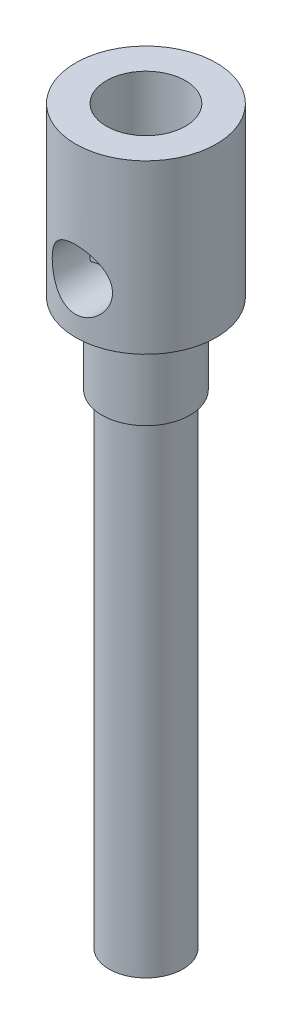
ISO-10303-21;
HEADER;
FILE_DESCRIPTION(('STEP AP214'),'2;1');
FILE_NAME('part.step','',(''),(''),'','','');
FILE_SCHEMA(('AUTOMOTIVE_DESIGN { 1 0 10303 214 1 1 1 1 }'));
ENDSEC;
DATA;
#1=APPLICATION_CONTEXT('core data for automotive mechanical design processes');
#2=APPLICATION_PROTOCOL_DEFINITION('international standard','automotive_design',2000,#1);
#3=PRODUCT_CONTEXT('',#1,'mechanical');
#4=PRODUCT('Part','Part','',(#3));
#5=PRODUCT_RELATED_PRODUCT_CATEGORY('part','',(#4));
#6=PRODUCT_DEFINITION_FORMATION('','',#4);
#7=PRODUCT_DEFINITION_CONTEXT('part definition',#1,'design');
#8=PRODUCT_DEFINITION('design','',#6,#7);
#9=PRODUCT_DEFINITION_SHAPE('','',#8);
#10=(LENGTH_UNIT() NAMED_UNIT(*) SI_UNIT(.MILLI.,.METRE.));
#11=(NAMED_UNIT(*) PLANE_ANGLE_UNIT() SI_UNIT($,.RADIAN.));
#12=(NAMED_UNIT(*) SI_UNIT($,.STERADIAN.) SOLID_ANGLE_UNIT());
#13=UNCERTAINTY_MEASURE_WITH_UNIT(LENGTH_MEASURE(1.E-05),#10,'distance_accuracy_value','');
#14=(GEOMETRIC_REPRESENTATION_CONTEXT(3) GLOBAL_UNCERTAINTY_ASSIGNED_CONTEXT((#13)) GLOBAL_UNIT_ASSIGNED_CONTEXT((#10,
#11,#12)) REPRESENTATION_CONTEXT('',''));
#15=CARTESIAN_POINT('',(0.,0.,0.));
#16=DIRECTION('',(0.,0.,1.));
#17=DIRECTION('',(1.,0.,0.));
#18=AXIS2_PLACEMENT_3D('',#15,#16,#17);
#19=CARTESIAN_POINT('',(0.,89.14,0.));
#20=DIRECTION('',(0.,1.,0.));
#21=DIRECTION('',(0.,0.,1.));
#22=AXIS2_PLACEMENT_3D('',#19,#20,#21);
#23=CONICAL_SURFACE('',#22,5.9,1.02974425867665);
#24=CARTESIAN_POINT('',(3.83789669676033,89.2904151547569,4.80594872874396));
#25=CARTESIAN_POINT('',(3.81465501508832,89.2524553964176,4.7436619122395));
#26=CARTESIAN_POINT('',(3.79059768278098,89.2144193572263,4.68172796314178));
#27=CARTESIAN_POINT('',(3.74070963196909,89.1381664999014,4.55867018536252));
#28=CARTESIAN_POINT('',(3.71487850955702,89.099949642451,4.49754654500099));
#29=CARTESIAN_POINT('',(3.63426595913431,88.9846371897143,4.31499756764214));
#30=CARTESIAN_POINT('',(3.57658974693528,88.9072503362683,4.19500531967459));
#31=CARTESIAN_POINT('',(3.45009227103632,88.7490719252159,3.95649410737801));
#32=CARTESIAN_POINT('',(3.3809666557596,88.6682521421191,3.83815363347766));
#33=CARTESIAN_POINT('',(3.23102157751017,88.5058808773594,3.6099209461963));
#34=CARTESIAN_POINT('',(3.15022788553552,88.4243313703607,3.50001091114363));
#35=CARTESIAN_POINT('',(3.01823690977529,88.3017623473378,3.34435645403201));
#36=CARTESIAN_POINT('',(2.9724116391185,88.260842619087,3.29398154404596));
#37=CARTESIAN_POINT('',(2.87684980844636,88.1791178688621,3.19700009872082));
#38=CARTESIAN_POINT('',(2.82711276275775,88.1383128617849,3.1503940327707));
#39=CARTESIAN_POINT('',(2.67277627995824,88.0174133059004,3.01850498011388));
#40=CARTESIAN_POINT('',(2.56190328660279,87.9377404971333,2.93973753317449));
#41=CARTESIAN_POINT('',(2.390083424388,87.8266735183407,2.84316523407075));
#42=CARTESIAN_POINT('',(2.33572509866345,87.793106093276,2.81584143221539));
#43=CARTESIAN_POINT('',(2.22396275142914,87.7274321529324,2.76601116265169));
#44=CARTESIAN_POINT('',(2.16655826650877,87.695325861323,2.7435054305507));
#45=CARTESIAN_POINT('',(2.04795347258658,87.6324485325928,2.70297375161093));
#46=CARTESIAN_POINT('',(1.9867015344391,87.6017148246536,2.68504181469125));
#47=CARTESIAN_POINT('',(1.86188757045787,87.5426621570094,2.65385374621151));
#48=CARTESIAN_POINT('',(1.79832570884567,87.5143430261198,2.64059728296815));
#49=CARTESIAN_POINT('',(1.73383672320518,87.4874332976742,2.62948917775113));
#50=B_SPLINE_CURVE_WITH_KNOTS('',3,(#24,#25,#26,#27,#28,#29,#30,#31,#32,#33,#34,#35,#36,#37,#38,
#39,#40,#41,#42,#43,#44,#45,#46,#47,#48,#49),.UNSPECIFIED.,.F.,.F.,(4,2,2,2,2,2,2,2,2,2,2,2,4),
(0.,0.229655953495695,0.459364376190661,0.921025845841524,1.39788280569153,1.87370220918514,
2.11187427917301,2.35007596665414,2.82016172886609,3.02841509306309,3.23670023007254,
3.44897280592613,3.66123031989665),.UNSPECIFIED.);
#51=CARTESIAN_POINT('',(3.74165738677393,89.14,4.56179789118281));
#52=VERTEX_POINT('',#51);
#53=CARTESIAN_POINT('',(2.05737283696751,87.6378484524311,2.70688326488384));
#54=VERTEX_POINT('',#53);
#55=EDGE_CURVE('E67',#52,#54,#50,.T.);
#56=ORIENTED_EDGE('',*,*,#55,.F.);
#57=CARTESIAN_POINT('',(0.,89.14,0.));
#58=DIRECTION('',(0.,1.,0.));
#59=DIRECTION('',(0.,0.,1.));
#60=AXIS2_PLACEMENT_3D('',#57,#58,#59);
#61=CIRCLE('',#60,5.9);
#62=CARTESIAN_POINT('',(-3.74165738677404,89.14,4.56179789118273));
#63=VERTEX_POINT('',#62);
#64=EDGE_CURVE('E87',#52,#63,#61,.T.);
#65=ORIENTED_EDGE('',*,*,#64,.T.);
#66=CARTESIAN_POINT('',(-1.73383672320518,87.4874332976742,2.62948917775112));
#67=CARTESIAN_POINT('',(-1.79985145195164,87.5149783283957,2.64085567985909));
#68=CARTESIAN_POINT('',(-1.86489459303967,87.5440020180542,2.65447937307516));
#69=CARTESIAN_POINT('',(-1.99255027609381,87.6045701199782,2.68663604547575));
#70=CARTESIAN_POINT('',(-2.0551626006703,87.6361147569258,2.70516946258604));
#71=CARTESIAN_POINT('',(-2.17670909621808,87.7008843991841,2.74727939277067));
#72=CARTESIAN_POINT('',(-2.23567889791703,87.7340841216387,2.77079142591228));
#73=CARTESIAN_POINT('',(-2.35035909222693,87.8019985523599,2.82292609226242));
#74=CARTESIAN_POINT('',(-2.40607015490876,87.8367129465942,2.85154766989311));
#75=CARTESIAN_POINT('',(-2.56763504191711,87.9421981320078,2.94448736190023));
#76=CARTESIAN_POINT('',(-2.66836755521036,88.0145541182111,3.01603711577961));
#77=CARTESIAN_POINT('',(-2.85633323638566,88.1606811520482,3.17421901252685));
#78=CARTESIAN_POINT('',(-2.94351968568045,88.2344561520461,3.26090125467391));
#79=CARTESIAN_POINT('',(-3.10442533642223,88.3805333142232,3.44315935191655));
#80=CARTESIAN_POINT('',(-3.17835684081008,88.4528382946258,3.53854919337832));
#81=CARTESIAN_POINT('',(-3.31654861646399,88.5968966137317,3.7365702406107));
#82=CARTESIAN_POINT('',(-3.380798652266,88.6686492935551,3.83920894404448));
#83=CARTESIAN_POINT('',(-3.50123989791547,88.8115623142372,4.04977141998999));
#84=CARTESIAN_POINT('',(-3.55741639857488,88.8827213569066,4.1577043701897));
#85=CARTESIAN_POINT('',(-3.66279395709436,89.024331367018,4.37725714444901));
#86=CARTESIAN_POINT('',(-3.71199854172206,89.0947826755909,4.48887506896336));
#87=CARTESIAN_POINT('',(-3.77201978830831,89.1859226484396,4.63569577950111));
#88=CARTESIAN_POINT('',(-3.78557405812752,89.2068860654943,4.66963436156011));
#89=CARTESIAN_POINT('',(-3.81213275670164,89.2487122974578,4.73766250393718));
#90=CARTESIAN_POINT('',(-3.82513843187227,89.2695752330602,4.77175150326384));
#91=CARTESIAN_POINT('',(-3.83789669676034,89.2904151547569,4.80594872874396));
#92=B_SPLINE_CURVE_WITH_KNOTS('',3,(#66,#67,#68,#69,#70,#71,#72,#73,#74,#75,#76,#77,#78,#79,#80,
#81,#82,#83,#84,#85,#86,#87,#88,#89,#90,#91),.UNSPECIFIED.,.F.,.F.,(4,2,2,2,2,2,2,2,2,2,2,2,4),
(0.,0.21727647190718,0.434572330449048,0.64920944411621,0.863802267231866,1.29141208894999,
1.72046542223478,2.14187290707008,2.5637228337324,2.98633184251011,3.40872630397466,
3.53511693231529,3.66120295316104),.UNSPECIFIED.);
#93=CARTESIAN_POINT('',(-2.05737283696751,87.6378484524311,2.70688326488384));
#94=VERTEX_POINT('',#93);
#95=EDGE_CURVE('E79',#94,#63,#92,.T.);
#96=ORIENTED_EDGE('',*,*,#95,.F.);
#97=CARTESIAN_POINT('',(0.,87.6378484524311,0.));
#98=DIRECTION('',(0.,1.,0.));
#99=DIRECTION('',(0.,0.,1.));
#100=AXIS2_PLACEMENT_3D('',#97,#98,#99);
#101=CIRCLE('',#100,3.39999999999999);
#102=EDGE_CURVE('E85',#94,#54,#101,.F.);
#103=ORIENTED_EDGE('',*,*,#102,.T.);
#104=EDGE_LOOP('',(#56,#65,#96,#103));
#105=FACE_BOUND('',#104,.T.);
#106=ADVANCED_FACE('F47',(#105),#23,.F.);
#107=CARTESIAN_POINT('',(0.,109.14,0.));
#108=DIRECTION('',(0.,-1.,0.));
#109=DIRECTION('',(0.,0.,-1.));
#110=AXIS2_PLACEMENT_3D('',#107,#108,#109);
#111=CYLINDRICAL_SURFACE('',#110,10.5);
#112=CARTESIAN_POINT('',(0.,109.14,0.));
#113=DIRECTION('',(0.,1.,0.));
#114=DIRECTION('',(0.,0.,1.));
#115=AXIS2_PLACEMENT_3D('',#112,#113,#114);
#116=CIRCLE('',#115,10.5);
#117=CARTESIAN_POINT('',(0.,109.14,10.5));
#118=VERTEX_POINT('',#117);
#119=EDGE_CURVE('E110',#118,#118,#116,.T.);
#120=ORIENTED_EDGE('',*,*,#119,.F.);
#121=EDGE_LOOP('',(#120));
#122=FACE_BOUND('',#121,.T.);
#123=CARTESIAN_POINT('',(0.,84.14,0.));
#124=DIRECTION('',(0.,1.,0.));
#125=DIRECTION('',(0.,0.,1.));
#126=AXIS2_PLACEMENT_3D('',#123,#124,#125);
#127=CIRCLE('',#126,10.5);
#128=CARTESIAN_POINT('',(0.,84.14,10.5));
#129=VERTEX_POINT('',#128);
#130=EDGE_CURVE('E113',#129,#129,#127,.T.);
#131=ORIENTED_EDGE('',*,*,#130,.T.);
#132=EDGE_LOOP('',(#131));
#133=FACE_BOUND('',#132,.T.);
#134=CARTESIAN_POINT('',(-4.5,91.64,9.48683298050514));
#135=CARTESIAN_POINT('',(-4.49999906141139,91.5202995600624,9.48683397099256));
#136=CARTESIAN_POINT('',(-4.49521679553787,91.4005603861069,9.48910646018652));
#137=CARTESIAN_POINT('',(-4.47613898428105,91.1619610504978,9.4981201796588));
#138=CARTESIAN_POINT('',(-4.46183745927418,91.0431014888635,9.50486421877831));
#139=CARTESIAN_POINT('',(-4.42383978012598,90.8069544482909,9.52260907656547));
#140=CARTESIAN_POINT('',(-4.40012428441132,90.6896707231327,9.53361865792482));
#141=CARTESIAN_POINT('',(-4.34356454154508,90.4577473357663,9.55951900224019));
#142=CARTESIAN_POINT('',(-4.31071643935259,90.3431088123262,9.57441140404048));
#143=CARTESIAN_POINT('',(-4.19927830867873,90.0053822239765,9.62407005478694));
#144=CARTESIAN_POINT('',(-4.10758555200189,89.7872086128521,9.66392166980367));
#145=CARTESIAN_POINT('',(-3.89232388292074,89.3695100495768,9.75260348450906));
#146=CARTESIAN_POINT('',(-3.7687612273255,89.1699814474359,9.8014319212971));
#147=CARTESIAN_POINT('',(-3.48456322096303,88.7818407636499,9.90616460766065));
#148=CARTESIAN_POINT('',(-3.32215273938251,88.5945950880757,9.96231738109402));
#149=CARTESIAN_POINT('',(-2.96845111562054,88.2489227130165,10.0733583761284));
#150=CARTESIAN_POINT('',(-2.77714851098893,88.0905075067705,10.1282460858311));
#151=CARTESIAN_POINT('',(-2.46712235836337,87.8743364315365,10.2066376712155));
#152=CARTESIAN_POINT('',(-2.35721887126182,87.8045703868795,10.23263960999));
#153=CARTESIAN_POINT('',(-2.13135444738344,87.6746149389223,10.2820553569392));
#154=CARTESIAN_POINT('',(-2.01539602621248,87.6144215999046,10.305470227545));
#155=CARTESIAN_POINT('',(-1.7781673370542,87.5041522371288,10.3490420403159));
#156=CARTESIAN_POINT('',(-1.6568966549432,87.4540770038536,10.369198727909));
#157=CARTESIAN_POINT('',(-1.40998105452095,87.3645837921682,10.4056481097136));
#158=CARTESIAN_POINT('',(-1.28433839036714,87.3251604110267,10.4219427622728));
#159=CARTESIAN_POINT('',(-1.03653667644566,87.2592320854769,10.449415290147));
#160=CARTESIAN_POINT('',(-0.914558553544912,87.232142223253,10.4608228402148));
#161=CARTESIAN_POINT('',(-0.668509042828456,87.1881796228577,10.4794230272905));
#162=CARTESIAN_POINT('',(-0.544438624901888,87.1713022775724,10.4866175648431));
#163=CARTESIAN_POINT('',(-0.295165274128851,87.1479463424529,10.4965915628851));
#164=CARTESIAN_POINT('',(-0.169962521914829,87.141466122476,10.4993717154956));
#165=CARTESIAN_POINT('',(0.0805637024839917,87.1389778967427,10.5004379943867));
#166=CARTESIAN_POINT('',(0.205887169446948,87.1429694566934,10.4987243070389));
#167=CARTESIAN_POINT('',(0.447550132745995,87.1607793897414,10.4911085691052));
#168=CARTESIAN_POINT('',(0.56394706957832,87.1739463950041,10.4854841949084));
#169=CARTESIAN_POINT('',(0.795162007020993,87.2092664028486,10.4704892379958));
#170=CARTESIAN_POINT('',(0.909979474220732,87.2314223676733,10.4611174203534));
#171=CARTESIAN_POINT('',(1.13718574302123,87.2844967005287,10.4388613974382));
#172=CARTESIAN_POINT('',(1.2495753383597,87.3154121567145,10.4259783594254));
#173=CARTESIAN_POINT('',(1.47126382263119,87.3857164562035,10.3970145638672));
#174=CARTESIAN_POINT('',(1.5805615129417,87.4251085360117,10.3809325850951));
#175=CARTESIAN_POINT('',(1.90600558322864,87.5568210612209,10.3279114499485));
#176=CARTESIAN_POINT('',(2.11642651285401,87.661908217208,10.2865327001964));
#177=CARTESIAN_POINT('',(2.51708943758982,87.902488758926,10.1959117353748));
#178=CARTESIAN_POINT('',(2.70732414708661,88.0379930682196,10.1466666971607));
#179=CARTESIAN_POINT('',(3.07730637290525,88.3472013065485,10.0409095428893));
#180=CARTESIAN_POINT('',(3.25523767241054,88.5229892526042,9.98412932812528));
#181=CARTESIAN_POINT('',(3.57996106893108,88.9020933163471,9.87235722550752));
#182=CARTESIAN_POINT('',(3.72673972423918,89.1054212552243,9.81736611824561));
#183=CARTESIAN_POINT('',(3.92289636789184,89.431422949412,9.7399220049227));
#184=CARTESIAN_POINT('',(3.98515882172847,89.5458324228576,9.71454394437125));
#185=CARTESIAN_POINT('',(4.09972774340763,89.7801052042553,9.66675140018682));
#186=CARTESIAN_POINT('',(4.15203857209838,89.8999660947077,9.64433561978993));
#187=CARTESIAN_POINT('',(4.2461887025501,90.1443301731604,9.60325588257495));
#188=CARTESIAN_POINT('',(4.28802975127888,90.2688325826966,9.58459129994148));
#189=CARTESIAN_POINT('',(4.36076245355803,90.5215101298364,9.55171956192506));
#190=CARTESIAN_POINT('',(4.39166000198653,90.6496832498152,9.53751000725054));
#191=CARTESIAN_POINT('',(4.44044499018209,90.8999990439061,9.51488944768222));
#192=CARTESIAN_POINT('',(4.45906597067886,91.0219696812594,9.50615347965095));
#193=CARTESIAN_POINT('',(4.48622869689185,91.2672208942333,9.49336502254418));
#194=CARTESIAN_POINT('',(4.49477508165474,91.3905008405491,9.48931037787855));
#195=CARTESIAN_POINT('',(4.5016933106819,91.6373950819798,9.48603036914482));
#196=CARTESIAN_POINT('',(4.50006639707054,91.7610093344349,9.48680441551029));
#197=CARTESIAN_POINT('',(4.48666285913419,92.0075572174516,9.49315072879474));
#198=CARTESIAN_POINT('',(4.47488657659695,92.1304908707925,9.49872283413543));
#199=CARTESIAN_POINT('',(4.44250253314067,92.3661626316797,9.5139091092013));
#200=CARTESIAN_POINT('',(4.42256820040608,92.47901370553,9.52321417177902));
#201=CARTESIAN_POINT('',(4.37425578911321,92.702535060453,9.54550072183475));
#202=CARTESIAN_POINT('',(4.34587495799257,92.8132046180537,9.55848340771768));
#203=CARTESIAN_POINT('',(4.24844432299969,93.1408460564035,9.60238855725539));
#204=CARTESIAN_POINT('',(4.16708172883988,93.3536271183632,9.63828040810657));
#205=CARTESIAN_POINT('',(3.97001944937047,93.7718494074053,9.72115136493081));
#206=CARTESIAN_POINT('',(3.85298063749387,93.976569265248,9.76854468110122));
#207=CARTESIAN_POINT('',(3.5891560180696,94.3645177720193,9.86852745234376));
#208=CARTESIAN_POINT('',(3.44235682828145,94.5477366939745,9.92111923952242));
#209=CARTESIAN_POINT('',(3.10818288400904,94.9040418113625,10.0310897225835));
#210=CARTESIAN_POINT('',(2.91838803667499,95.0748564810697,10.0884864802651));
#211=CARTESIAN_POINT('',(2.51138436988912,95.3827177323174,10.1974093979425));
#212=CARTESIAN_POINT('',(2.2941728080502,95.5197609317753,10.248934969684));
#213=CARTESIAN_POINT('',(1.95145751057212,95.6969125701894,10.3177320663526));
#214=CARTESIAN_POINT('',(1.83401956637614,95.7513494107861,10.3393017510588));
#215=CARTESIAN_POINT('',(1.59439830841457,95.8500657873376,10.3789498863011));
#216=CARTESIAN_POINT('',(1.47221707870619,95.8943497264121,10.3970298497229));
#217=CARTESIAN_POINT('',(1.22403636201211,95.9722804266614,10.4291608104112));
#218=CARTESIAN_POINT('',(1.09803801950396,96.0059303422927,10.4432130023529));
#219=CARTESIAN_POINT('',(0.843195719375319,96.0622214299546,10.4668709662135));
#220=CARTESIAN_POINT('',(0.714351991663487,96.0848634880483,10.4764770960093));
#221=CARTESIAN_POINT('',(0.464454496797972,96.1176085350718,10.4904135975659));
#222=CARTESIAN_POINT('',(0.343523442959358,96.1285101903334,10.4950795755399));
#223=CARTESIAN_POINT('',(0.101042401345378,96.1405031710165,10.500214211638));
#224=CARTESIAN_POINT('',(-0.0205077803860849,96.1415912053825,10.5006814616937));
#225=CARTESIAN_POINT('',(-0.263172001736714,96.133936893924,10.4974023981599));
#226=CARTESIAN_POINT('',(-0.384286246477131,96.1252000200456,10.4936584299925));
#227=CARTESIAN_POINT('',(-0.625261688913649,96.0979992380174,10.4820611755407));
#228=CARTESIAN_POINT('',(-0.745122403639524,96.0795317120666,10.4742063608743));
#229=CARTESIAN_POINT('',(-0.977952622332633,96.0339860318452,10.4549846194611));
#230=CARTESIAN_POINT('',(-1.09100706977708,96.0072777708225,10.4437690703947));
#231=CARTESIAN_POINT('',(-1.31438006086796,95.9453292631263,10.4180168735722));
#232=CARTESIAN_POINT('',(-1.42469763344897,95.9100860345883,10.4034790652174));
#233=CARTESIAN_POINT('',(-1.75045024540138,95.7920074725495,10.3553816677529));
#234=CARTESIAN_POINT('',(-1.96087663425213,95.6967853551326,10.3173214569429));
#235=CARTESIAN_POINT('',(-2.37249752325607,95.4713060877692,10.2307190241844));
#236=CARTESIAN_POINT('',(-2.5728327816168,95.3396486782894,10.1817777869875));
#237=CARTESIAN_POINT('',(-2.94947024164531,95.0469798695899,10.0791246939867));
#238=CARTESIAN_POINT('',(-3.12576288605247,94.8859568562516,10.0254109549802));
#239=CARTESIAN_POINT('',(-3.4625965390479,94.5254234820475,9.91434025007818));
#240=CARTESIAN_POINT('',(-3.62106351124926,94.3239671891183,9.85700202596036));
#241=CARTESIAN_POINT('',(-3.90235669160611,93.8954809899712,9.74907225126575));
#242=CARTESIAN_POINT('',(-4.02516215767077,93.6684363067041,9.69848463630781));
#243=CARTESIAN_POINT('',(-4.1792738389484,93.3134262871312,9.63258880555672));
#244=CARTESIAN_POINT('',(-4.22562002955416,93.1927162881412,9.61229184376083));
#245=CARTESIAN_POINT('',(-4.30788642794622,92.9472255940681,9.57570616379643));
#246=CARTESIAN_POINT('',(-4.34381179569293,92.8224469477769,9.5594154625037));
#247=CARTESIAN_POINT('',(-4.40473833640814,92.5701037971635,9.53149521742022));
#248=CARTESIAN_POINT('',(-4.42976828042402,92.4425475754647,9.51985340433172));
#249=CARTESIAN_POINT('',(-4.4687083821586,92.1854558059212,9.5016374175481));
#250=CARTESIAN_POINT('',(-4.48262706125572,92.0559218526781,9.49505936052889));
#251=CARTESIAN_POINT('',(-4.49393370756842,91.8784079500341,9.48970842647858));
#252=CARTESIAN_POINT('',(-4.4962077999073,91.8307637114086,9.48863098692814));
#253=CARTESIAN_POINT('',(-4.49924114530073,91.7354150336965,9.48719306080706));
#254=CARTESIAN_POINT('',(-4.50000037410573,91.6877105936584,9.48683258571342));
#255=CARTESIAN_POINT('',(-4.5,91.64,9.48683298050514));
#256=B_SPLINE_CURVE_WITH_KNOTS('',3,(#134,#135,#136,#137,#138,#139,#140,#141,#142,#143,#144,
#145,#146,#147,#148,#149,#150,#151,#152,#153,#154,#155,#156,#157,#158,#159,#160,#161,#162,#163,
#164,#165,#166,#167,#168,#169,#170,#171,#172,#173,#174,#175,#176,#177,#178,#179,#180,#181,#182,
#183,#184,#185,#186,#187,#188,#189,#190,#191,#192,#193,#194,#195,#196,#197,#198,#199,#200,#201,
#202,#203,#204,#205,#206,#207,#208,#209,#210,#211,#212,#213,#214,#215,#216,#217,#218,#219,#220,
#221,#222,#223,#224,#225,#226,#227,#228,#229,#230,#231,#232,#233,#234,#235,#236,#237,#238,#239,
#240,#241,#242,#243,#244,#245,#246,#247,#248,#249,#250,#251,#252,#253,#254,#255),.UNSPECIFIED.,
.T.,.F.,(4,2,2,2,2,2,2,2,2,2,2,2,2,2,2,2,2,2,2,2,2,2,2,2,2,2,2,2,2,2,2,2,2,2,2,2,2,2,2,2,2,2,2,
2,2,2,2,2,2,2,2,2,2,2,2,2,2,2,2,2,4),(0.,0.359051477890603,0.718328710894707,1.07834795333455,
1.43851939784651,2.1550242770475,2.87138859645477,3.63059306509893,4.3900995300709,
4.78792072259997,5.18557792989812,5.58326619240163,5.98075236296101,6.35666947595136,
6.73241687694944,7.10810535957364,7.48377826163169,7.83518638876844,8.18671041395097,
8.53811772174353,8.88965944106227,9.60277043585712,10.3161379375814,11.0822658157879,
11.8487235929477,12.2464032614308,12.643908261397,13.0413468901311,13.4385711059121,
13.8091561008478,14.179570385861,14.5499394454606,14.920296033087,15.264815290919,
15.609446944566,16.2981809569751,17.0168602823144,17.7358634932389,18.5174746357193,
19.2991640217641,19.6924081023656,20.0854813165475,20.4784378205494,20.8713626887909,
21.2354347570612,21.599628914505,21.9636203357776,22.3277471825773,22.677456329396,
23.027287830925,23.7263701139488,24.4573481429474,25.1886159037681,25.9729961860792,
26.7578317842205,27.1500421335876,27.5420579437937,27.933032201508,28.3237063269766,
28.4668159509497,28.6099278657682),.UNSPECIFIED.);
#257=CARTESIAN_POINT('',(-4.5,91.64,9.48683298050514));
#258=VERTEX_POINT('',#257);
#259=EDGE_CURVE('E121',#258,#258,#256,.T.);
#260=ORIENTED_EDGE('',*,*,#259,.F.);
#261=EDGE_LOOP('',(#260));
#262=FACE_BOUND('',#261,.T.);
#263=ADVANCED_FACE('F134',(#122,#133,#262),#111,.T.);
#264=CARTESIAN_POINT('',(0.,109.14,0.));
#265=DIRECTION('',(0.,1.,0.));
#266=DIRECTION('',(0.,0.,1.));
#267=AXIS2_PLACEMENT_3D('',#264,#265,#266);
#268=CYLINDRICAL_SURFACE('',#267,5.9);
#269=CARTESIAN_POINT('',(0.,109.14,0.));
#270=DIRECTION('',(0.,1.,0.));
#271=DIRECTION('',(0.,0.,1.));
#272=AXIS2_PLACEMENT_3D('',#269,#270,#271);
#273=CIRCLE('',#272,5.9);
#274=CARTESIAN_POINT('',(0.,109.14,5.9));
#275=VERTEX_POINT('',#274);
#276=EDGE_CURVE('E90',#275,#275,#273,.T.);
#277=ORIENTED_EDGE('',*,*,#276,.T.);
#278=EDGE_LOOP('',(#277));
#279=FACE_BOUND('',#278,.T.);
#280=CARTESIAN_POINT('',(-3.74165738677393,89.14,4.56179789118282));
#281=CARTESIAN_POINT('',(-3.79956858136587,89.2267004013625,4.51431264993979));
#282=CARTESIAN_POINT('',(-3.85462443689806,89.3155984408199,4.46729606956594));
#283=CARTESIAN_POINT('',(-3.95886762517798,89.4979329381883,4.37517766267526));
#284=CARTESIAN_POINT('',(-4.00804577620684,89.5913761840543,4.33007890103089));
#285=CARTESIAN_POINT('',(-4.10080841630908,89.7839490300342,4.24234692814876));
#286=CARTESIAN_POINT('',(-4.14430980724679,89.8831377310182,4.19975448800834));
#287=CARTESIAN_POINT('',(-4.22452621369435,90.0858830130369,4.11905454179399));
#288=CARTESIAN_POINT('',(-4.26124525466417,90.1894369580913,4.08094438030941));
#289=CARTESIAN_POINT('',(-4.34637190044331,90.4613316312675,3.99059215402424));
#290=CARTESIAN_POINT('',(-4.38949788221869,90.6329312693094,3.94269058396097));
#291=CARTESIAN_POINT('',(-4.43896056177072,90.8959774697901,3.8866747049999));
#292=CARTESIAN_POINT('',(-4.45289634717768,90.9843999267117,3.87066012586554));
#293=CARTESIAN_POINT('',(-4.47552237680745,91.1627544949927,3.84447688501968));
#294=CARTESIAN_POINT('',(-4.48421526394782,91.2526858221989,3.83430527801972));
#295=CARTESIAN_POINT('',(-4.49621811745134,91.4341726229506,3.82022385914283));
#296=CARTESIAN_POINT('',(-4.49948161507569,91.5257354056594,3.81636810730684));
#297=CARTESIAN_POINT('',(-4.50040419583472,91.7089281783732,3.81528016842591));
#298=CARTESIAN_POINT('',(-4.49806338650797,91.800558167055,3.81804785428674));
#299=CARTESIAN_POINT('',(-4.48782633215695,91.9832135934113,3.83007518080578));
#300=CARTESIAN_POINT('',(-4.47992157883031,92.0742378893981,3.8393447639953));
#301=CARTESIAN_POINT('',(-4.45872430993849,92.2548615731737,3.8639408782549));
#302=CARTESIAN_POINT('',(-4.4454288799301,92.344460162886,3.87927068564361));
#303=CARTESIAN_POINT('',(-4.41105265500633,92.5364648420993,3.91834113787956));
#304=CARTESIAN_POINT('',(-4.38904139757862,92.6385053074794,3.94305994435114));
#305=CARTESIAN_POINT('',(-4.33848777320859,92.8392741617293,3.99861711938759));
#306=CARTESIAN_POINT('',(-4.30994056710411,92.9380000340882,4.02946001992336));
#307=CARTESIAN_POINT('',(-4.21506825787698,93.2289819101242,4.12935604483761));
#308=CARTESIAN_POINT('',(-4.13955480784408,93.4158146266468,4.20572504976716));
#309=CARTESIAN_POINT('',(-3.99348575233797,93.7187095464593,4.34383296830513));
#310=CARTESIAN_POINT('',(-3.92854002813513,93.8388737031185,4.40285402827266));
#311=CARTESIAN_POINT('',(-3.78872071158437,94.0718807350666,4.52372911842463));
#312=CARTESIAN_POINT('',(-3.71384367291958,94.1847210485339,4.58558412713272));
#313=CARTESIAN_POINT('',(-3.55445088062269,94.4029992068694,4.71021569364205));
#314=CARTESIAN_POINT('',(-3.46992620479631,94.508430051454,4.7729930569337));
#315=CARTESIAN_POINT('',(-3.29149851140706,94.711530875095,4.8977429961625));
#316=CARTESIAN_POINT('',(-3.19759671045993,94.8092018579938,4.95971567532577));
#317=CARTESIAN_POINT('',(-2.99935083798483,94.9975005091988,5.08208909758474));
#318=CARTESIAN_POINT('',(-2.89489285888791,95.0880271463731,5.1424612539748));
#319=CARTESIAN_POINT('',(-2.676704703297,95.2600207174315,5.25933188983149));
#320=CARTESIAN_POINT('',(-2.5629733414483,95.3414864899694,5.31582987238373));
#321=CARTESIAN_POINT('',(-2.32685271794825,95.494279605869,5.42333216674589));
#322=CARTESIAN_POINT('',(-2.20448452485266,95.5656304248163,5.47434913035403));
#323=CARTESIAN_POINT('',(-1.95152661864368,95.6973246273419,5.56954381371502));
#324=CARTESIAN_POINT('',(-1.82094084122724,95.7576732271134,5.61372477293193));
#325=CARTESIAN_POINT('',(-1.49670107341548,95.8887353080306,5.71043296994753));
#326=CARTESIAN_POINT('',(-1.29929232827236,95.9534195602609,5.75885968087273));
#327=CARTESIAN_POINT('',(-0.893821931560162,96.0552830868447,5.8355462937479));
#328=CARTESIAN_POINT('',(-0.685768430127678,96.0924830772309,5.86382138424378));
#329=CARTESIAN_POINT('',(-0.263883728134133,96.1372745192531,5.89790302128201));
#330=CARTESIAN_POINT('',(-0.0500352445141915,96.1447645706597,5.90363261937102));
#331=CARTESIAN_POINT('',(0.375917025012574,96.1293335535191,5.89186656752143));
#332=CARTESIAN_POINT('',(0.588020646881041,96.1064096578336,5.87436875847165));
#333=CARTESIAN_POINT('',(0.993406620276562,96.0335675572586,5.81918474380816));
#334=CARTESIAN_POINT('',(1.18709814712624,95.9850752763118,5.78256585941422));
#335=CARTESIAN_POINT('',(1.56280957803207,95.8645225859789,5.69253795375023));
#336=CARTESIAN_POINT('',(1.74482676938629,95.7924567224873,5.63912504703983));
#337=CARTESIAN_POINT('',(2.11063913371796,95.6199297865333,5.51325947150916));
#338=CARTESIAN_POINT('',(2.29302255339797,95.5174499317883,5.43949726805699));
#339=CARTESIAN_POINT('',(2.63852184323706,95.2911535205873,5.28057129265156));
#340=CARTESIAN_POINT('',(2.80162507545189,95.167323098373,5.19540011940882));
#341=CARTESIAN_POINT('',(3.13759749933656,94.8748679710999,5.00101192532436));
#342=CARTESIAN_POINT('',(3.30612667928796,94.70221985652,4.89035185059334));
#343=CARTESIAN_POINT('',(3.61351312918863,94.3326550389079,4.66781663845212));
#344=CARTESIAN_POINT('',(3.75234229772669,94.1357156273284,4.55594045461758));
#345=CARTESIAN_POINT('',(3.98299445161199,93.7448824568612,4.35500751394389));
#346=CARTESIAN_POINT('',(4.07854317806045,93.5537589887703,4.26485485076304));
#347=CARTESIAN_POINT('',(4.24319926263014,93.15386460996,4.10106427143864));
#348=CARTESIAN_POINT('',(4.3123636531526,92.9451329684069,4.02739087803884));
#349=CARTESIAN_POINT('',(4.40697596559516,92.5656038317367,3.92329898107726));
#350=CARTESIAN_POINT('',(4.43900525523343,92.3981920008683,3.88668907091022));
#351=CARTESIAN_POINT('',(4.48384846989886,92.0576829038832,3.83488338529178));
#352=CARTESIAN_POINT('',(4.49669772173227,91.8845966918184,3.81964824378246));
#353=CARTESIAN_POINT('',(4.50218618718894,91.5371374170046,3.81318140698554));
#354=CARTESIAN_POINT('',(4.49476823121641,91.3627621006394,3.82201761177461));
#355=CARTESIAN_POINT('',(4.46024320801131,91.0184773636175,3.86223706285926));
#356=CARTESIAN_POINT('',(4.43309926732235,90.8485769249839,3.89366253369836));
#357=CARTESIAN_POINT('',(4.3501007527559,90.4672356370023,3.98641562285105));
#358=CARTESIAN_POINT('',(4.28806216873989,90.2586910423728,4.05389783173574));
#359=CARTESIAN_POINT('',(4.13788692270232,89.8584965525426,4.20705742353597));
#360=CARTESIAN_POINT('',(4.04971681916374,89.6668687167113,4.29275808132896));
#361=CARTESIAN_POINT('',(3.91754873613225,89.4247452179208,4.41188559538905));
#362=CARTESIAN_POINT('',(3.88397567412789,89.3664035498873,4.44149177764545));
#363=CARTESIAN_POINT('',(3.81454336343817,89.2517508170933,4.5012597441704));
#364=CARTESIAN_POINT('',(3.77869327874034,89.1954328836892,4.53141899219247));
#365=CARTESIAN_POINT('',(3.74165738677393,89.14,4.56179789118282));
#366=B_SPLINE_CURVE_WITH_KNOTS('',3,(#280,#281,#282,#283,#284,#285,#286,#287,#288,#289,#290,
#291,#292,#293,#294,#295,#296,#297,#298,#299,#300,#301,#302,#303,#304,#305,#306,#307,#308,#309,
#310,#311,#312,#313,#314,#315,#316,#317,#318,#319,#320,#321,#322,#323,#324,#325,#326,#327,#328,
#329,#330,#331,#332,#333,#334,#335,#336,#337,#338,#339,#340,#341,#342,#343,#344,#345,#346,#347,
#348,#349,#350,#351,#352,#353,#354,#355,#356,#357,#358,#359,#360,#361,#362,#363,#364,#365),
.UNSPECIFIED.,.F.,.F.,(4,2,2,2,2,2,2,2,2,2,2,2,2,2,2,2,2,2,2,2,2,2,2,2,2,2,2,2,2,2,2,2,2,2,2,2,
2,2,2,2,2,2,4),(0.,0.343678463743009,0.687886967720736,1.03667360980378,1.38525257016359,
1.93268420981892,2.20520327510172,2.47758484988141,2.75228589602645,3.0269816710961,
3.30209842212866,3.57736411245759,3.89869005366628,4.22025467572227,4.86408655717379,
5.31003095568201,5.75613051052955,6.20264601575325,6.64910366382718,7.10103485447271,
7.55302390330309,8.00394613636124,8.45465402638099,9.09169050638264,9.72824633422994,
10.366972871744,11.0057587864486,11.6121934040662,12.2187684288751,12.8818085872111,
13.5452809787265,14.338651375236,15.1327691511365,15.8263615871171,16.518446140986,
17.0393642269204,17.5593216694131,18.0807473172796,18.6031501728433,19.282854485304,
19.963432425513,20.1839972610044,20.4037246719788),.UNSPECIFIED.);
#367=EDGE_CURVE('E72',#63,#52,#366,.T.);
#368=ORIENTED_EDGE('',*,*,#367,.F.);
#369=ORIENTED_EDGE('',*,*,#64,.F.);
#370=EDGE_LOOP('',(#368,#369));
#371=FACE_BOUND('',#370,.T.);
#372=ADVANCED_FACE('F159',(#279,#371),#268,.F.);
#373=CARTESIAN_POINT('',(0.,90.14,0.));
#374=DIRECTION('',(0.,1.,0.));
#375=DIRECTION('',(0.,0.,1.));
#376=AXIS2_PLACEMENT_3D('',#373,#374,#375);
#377=CYLINDRICAL_SURFACE('',#376,3.39999999999999);
#378=CARTESIAN_POINT('',(0.,11.,0.));
#379=DIRECTION('',(0.,1.,0.));
#380=DIRECTION('',(0.,0.,1.));
#381=AXIS2_PLACEMENT_3D('',#378,#379,#380);
#382=CIRCLE('',#381,3.39999999999998);
#383=CARTESIAN_POINT('',(0.,11.,3.39999999999998));
#384=VERTEX_POINT('',#383);
#385=EDGE_CURVE('E95',#384,#384,#382,.T.);
#386=ORIENTED_EDGE('',*,*,#385,.F.);
#387=EDGE_LOOP('',(#386));
#388=FACE_BOUND('',#387,.T.);
#389=CARTESIAN_POINT('',(2.05737283696751,87.6378484524311,2.70688326488384));
#390=CARTESIAN_POINT('',(1.99172947367666,87.6041090165873,2.75675912952505));
#391=CARTESIAN_POINT('',(1.92400335887136,87.5713331227017,2.80447977516467));
#392=CARTESIAN_POINT('',(1.78438277921421,87.5081868729261,2.89533358321751));
#393=CARTESIAN_POINT('',(1.71248465814542,87.4778186839458,2.93846262493506));
#394=CARTESIAN_POINT('',(1.48986723867731,87.3908038477876,3.06088101866448));
#395=CARTESIAN_POINT('',(1.33297412772964,87.3386432677986,3.13262554524214));
#396=CARTESIAN_POINT('',(1.08751449261203,87.2725513814837,3.22257846371472));
#397=CARTESIAN_POINT('',(1.00370392293767,87.2524980879853,3.24968082572015));
#398=CARTESIAN_POINT('',(0.833340556391086,87.2169816319815,3.29747638951643));
#399=CARTESIAN_POINT('',(0.746789323324496,87.2015159022711,3.31817317615566));
#400=CARTESIAN_POINT('',(0.571878692675837,87.1756129480554,3.35274240668288));
#401=CARTESIAN_POINT('',(0.483525670581787,87.165160413488,3.36663563109933));
#402=CARTESIAN_POINT('',(0.305542922014688,87.1494968291129,3.38742764647417));
#403=CARTESIAN_POINT('',(0.215913380455976,87.1442850278185,3.39432744024567));
#404=CARTESIAN_POINT('',(0.0460967945905924,87.1395242925378,3.40063002807757));
#405=CARTESIAN_POINT('',(-0.0340484673267212,87.1394172974739,3.40077163281262));
#406=CARTESIAN_POINT('',(-0.194068328133666,87.14347412654,3.39540102009442));
#407=CARTESIAN_POINT('',(-0.273942828796041,87.1476393624361,3.38988693370838));
#408=CARTESIAN_POINT('',(-0.432809313397078,87.1601534726352,3.37328550306111));
#409=CARTESIAN_POINT('',(-0.511800964606189,87.1685038732766,3.36219612547494));
#410=CARTESIAN_POINT('',(-0.668314590481085,87.1892022912856,3.33461858632919));
#411=CARTESIAN_POINT('',(-0.745836001018294,87.2015518115234,3.3181283951161));
#412=CARTESIAN_POINT('',(-0.970071740322951,87.2432437260683,3.26222055793714));
#413=CARTESIAN_POINT('',(-1.11414558791988,87.2777130417624,3.21573672290594));
#414=CARTESIAN_POINT('',(-1.39199166342982,87.3582557175325,3.10559827000662));
#415=CARTESIAN_POINT('',(-1.52576266536458,87.4043304558086,3.04194161271885));
#416=CARTESIAN_POINT('',(-1.7247389216751,87.4829395864448,2.9311991740279));
#417=CARTESIAN_POINT('',(-1.79409102870796,87.5124437003121,2.88924538476754));
#418=CARTESIAN_POINT('',(-1.92873579331518,87.5736219271395,2.80114656802827));
#419=CARTESIAN_POINT('',(-1.99404017552971,87.6052891545924,2.75501469999835));
#420=CARTESIAN_POINT('',(-2.05737283696751,87.6378484524311,2.70688326488384));
#421=B_SPLINE_CURVE_WITH_KNOTS('',3,(#389,#390,#391,#392,#393,#394,#395,#396,#397,#398,#399,
#400,#401,#402,#403,#404,#405,#406,#407,#408,#409,#410,#411,#412,#413,#414,#415,#416,#417,#418,
#419,#420),.UNSPECIFIED.,.F.,.F.,(4,2,2,2,2,2,2,2,2,2,2,2,2,2,2,4),(0.,0.267091572959907,
0.534420859481832,1.07212371204839,1.34283231992097,1.61338915196671,1.88311437017427,
2.15280090604097,2.39292885425228,2.63313617872765,2.87343117113167,3.11381657144606,
3.57757314248495,4.04138481285006,4.29995709712938,4.55774155594411),.UNSPECIFIED.);
#422=EDGE_CURVE('E11',#54,#94,#421,.T.);
#423=ORIENTED_EDGE('',*,*,#422,.F.);
#424=ORIENTED_EDGE('',*,*,#102,.F.);
#425=EDGE_LOOP('',(#423,#424));
#426=FACE_BOUND('',#425,.T.);
#427=ADVANCED_FACE('F89',(#388,#426),#377,.F.);
#428=CARTESIAN_POINT('',(0.,0.,0.));
#429=DIRECTION('',(0.,1.,0.));
#430=DIRECTION('',(0.,0.,1.));
#431=AXIS2_PLACEMENT_3D('',#428,#429,#430);
#432=PLANE('',#431);
#433=CARTESIAN_POINT('',(0.,0.,0.));
#434=DIRECTION('',(0.,1.,0.));
#435=DIRECTION('',(0.,0.,1.));
#436=AXIS2_PLACEMENT_3D('',#433,#434,#435);
#437=CIRCLE('',#436,5.5);
#438=CARTESIAN_POINT('',(0.,0.,5.5));
#439=VERTEX_POINT('',#438);
#440=EDGE_CURVE('E98',#439,#439,#437,.T.);
#441=ORIENTED_EDGE('',*,*,#440,.F.);
#442=EDGE_LOOP('',(#441));
#443=FACE_BOUND('',#442,.T.);
#444=CARTESIAN_POINT('',(0.,0.,0.));
#445=DIRECTION('',(0.,1.,0.));
#446=DIRECTION('',(0.,0.,1.));
#447=AXIS2_PLACEMENT_3D('',#444,#445,#446);
#448=CIRCLE('',#447,2.58);
#449=CARTESIAN_POINT('',(0.,0.,2.58));
#450=VERTEX_POINT('',#449);
#451=EDGE_CURVE('E101',#450,#450,#448,.T.);
#452=ORIENTED_EDGE('',*,*,#451,.T.);
#453=EDGE_LOOP('',(#452));
#454=FACE_BOUND('',#453,.T.);
#455=ADVANCED_FACE('F190',(#443,#454),#432,.F.);
#456=CARTESIAN_POINT('',(0.,72.14,0.));
#457=DIRECTION('',(0.,-1.,0.));
#458=DIRECTION('',(0.,0.,-1.));
#459=AXIS2_PLACEMENT_3D('',#456,#457,#458);
#460=CYLINDRICAL_SURFACE('',#459,5.5);
#461=CARTESIAN_POINT('',(0.,72.14,0.));
#462=DIRECTION('',(0.,1.,0.));
#463=DIRECTION('',(0.,0.,1.));
#464=AXIS2_PLACEMENT_3D('',#461,#462,#463);
#465=CIRCLE('',#464,5.5);
#466=CARTESIAN_POINT('',(0.,72.14,5.5));
#467=VERTEX_POINT('',#466);
#468=EDGE_CURVE('E61',#467,#467,#465,.T.);
#469=ORIENTED_EDGE('',*,*,#468,.F.);
#470=EDGE_LOOP('',(#469));
#471=FACE_BOUND('',#470,.T.);
#472=ORIENTED_EDGE('',*,*,#440,.T.);
#473=EDGE_LOOP('',(#472));
#474=FACE_BOUND('',#473,.T.);
#475=ADVANCED_FACE('F49',(#471,#474),#460,.T.);
#476=CARTESIAN_POINT('',(0.,72.14,0.));
#477=DIRECTION('',(0.,-1.,0.));
#478=DIRECTION('',(0.,0.,-1.));
#479=AXIS2_PLACEMENT_3D('',#476,#477,#478);
#480=CYLINDRICAL_SURFACE('',#479,2.58);
#481=CARTESIAN_POINT('',(0.,10.5072942923974,0.));
#482=DIRECTION('',(0.,1.,0.));
#483=DIRECTION('',(0.,0.,1.));
#484=AXIS2_PLACEMENT_3D('',#481,#482,#483);
#485=CIRCLE('',#484,2.58);
#486=CARTESIAN_POINT('',(0.,10.5072942923974,2.58));
#487=VERTEX_POINT('',#486);
#488=EDGE_CURVE('E91',#487,#487,#485,.F.);
#489=ORIENTED_EDGE('',*,*,#488,.F.);
#490=EDGE_LOOP('',(#489));
#491=FACE_BOUND('',#490,.T.);
#492=ORIENTED_EDGE('',*,*,#451,.F.);
#493=EDGE_LOOP('',(#492));
#494=FACE_BOUND('',#493,.T.);
#495=ADVANCED_FACE('F203',(#491,#494),#480,.F.);
#496=CARTESIAN_POINT('',(0.,84.14,0.));
#497=DIRECTION('',(0.,-1.,0.));
#498=DIRECTION('',(0.,0.,-1.));
#499=AXIS2_PLACEMENT_3D('',#496,#497,#498);
#500=CYLINDRICAL_SURFACE('',#499,6.5785);
#501=CARTESIAN_POINT('',(0.,84.14,0.));
#502=DIRECTION('',(0.,1.,0.));
#503=DIRECTION('',(0.,0.,1.));
#504=AXIS2_PLACEMENT_3D('',#501,#502,#503);
#505=CIRCLE('',#504,6.5785);
#506=CARTESIAN_POINT('',(0.,84.14,6.5785));
#507=VERTEX_POINT('',#506);
#508=EDGE_CURVE('E106',#507,#507,#505,.T.);
#509=ORIENTED_EDGE('',*,*,#508,.F.);
#510=EDGE_LOOP('',(#509));
#511=FACE_BOUND('',#510,.T.);
#512=CARTESIAN_POINT('',(0.,72.14,0.));
#513=DIRECTION('',(0.,1.,0.));
#514=DIRECTION('',(0.,0.,1.));
#515=AXIS2_PLACEMENT_3D('',#512,#513,#514);
#516=CIRCLE('',#515,6.5785);
#517=CARTESIAN_POINT('',(0.,72.14,6.5785));
#518=VERTEX_POINT('',#517);
#519=EDGE_CURVE('E107',#518,#518,#516,.T.);
#520=ORIENTED_EDGE('',*,*,#519,.T.);
#521=EDGE_LOOP('',(#520));
#522=FACE_BOUND('',#521,.T.);
#523=ADVANCED_FACE('F210',(#511,#522),#500,.T.);
#524=CARTESIAN_POINT('',(0.,72.14,0.));
#525=DIRECTION('',(0.,1.,0.));
#526=DIRECTION('',(0.,0.,1.));
#527=AXIS2_PLACEMENT_3D('',#524,#525,#526);
#528=PLANE('',#527);
#529=ORIENTED_EDGE('',*,*,#468,.T.);
#530=EDGE_LOOP('',(#529));
#531=FACE_BOUND('',#530,.T.);
#532=ORIENTED_EDGE('',*,*,#519,.F.);
#533=EDGE_LOOP('',(#532));
#534=FACE_BOUND('',#533,.T.);
#535=ADVANCED_FACE('F165',(#531,#534),#528,.F.);
#536=CARTESIAN_POINT('',(0.,109.14,0.));
#537=DIRECTION('',(0.,1.,0.));
#538=DIRECTION('',(0.,0.,1.));
#539=AXIS2_PLACEMENT_3D('',#536,#537,#538);
#540=PLANE('',#539);
#541=ORIENTED_EDGE('',*,*,#276,.F.);
#542=EDGE_LOOP('',(#541));
#543=FACE_BOUND('',#542,.T.);
#544=ORIENTED_EDGE('',*,*,#119,.T.);
#545=EDGE_LOOP('',(#544));
#546=FACE_BOUND('',#545,.T.);
#547=ADVANCED_FACE('F161',(#543,#546),#540,.T.);
#548=CARTESIAN_POINT('',(0.,84.14,0.));
#549=DIRECTION('',(0.,1.,0.));
#550=DIRECTION('',(0.,0.,1.));
#551=AXIS2_PLACEMENT_3D('',#548,#549,#550);
#552=PLANE('',#551);
#553=ORIENTED_EDGE('',*,*,#508,.T.);
#554=EDGE_LOOP('',(#553));
#555=FACE_BOUND('',#554,.T.);
#556=ORIENTED_EDGE('',*,*,#130,.F.);
#557=EDGE_LOOP('',(#556));
#558=FACE_BOUND('',#557,.T.);
#559=ADVANCED_FACE('F164',(#555,#558),#552,.F.);
#560=CARTESIAN_POINT('',(0.,11.,0.));
#561=DIRECTION('',(0.,1.,0.));
#562=DIRECTION('',(0.,0.,1.));
#563=AXIS2_PLACEMENT_3D('',#560,#561,#562);
#564=CONICAL_SURFACE('',#563,3.39999999999998,1.02974425867665);
#565=ORIENTED_EDGE('',*,*,#488,.T.);
#566=EDGE_LOOP('',(#565));
#567=FACE_BOUND('',#566,.T.);
#568=ORIENTED_EDGE('',*,*,#385,.T.);
#569=EDGE_LOOP('',(#568));
#570=FACE_BOUND('',#569,.T.);
#571=ADVANCED_FACE('F140',(#567,#570),#564,.F.);
#572=CARTESIAN_POINT('',(0.,91.64,20.));
#573=DIRECTION('',(0.,0.,-1.));
#574=DIRECTION('',(-1.,0.,0.));
#575=AXIS2_PLACEMENT_3D('',#572,#573,#574);
#576=CYLINDRICAL_SURFACE('',#575,4.5);
#577=ORIENTED_EDGE('',*,*,#367,.T.);
#578=ORIENTED_EDGE('',*,*,#55,.T.);
#579=ORIENTED_EDGE('',*,*,#422,.T.);
#580=ORIENTED_EDGE('',*,*,#95,.T.);
#581=EDGE_LOOP('',(#577,#578,#579,#580));
#582=FACE_BOUND('',#581,.T.);
#583=ORIENTED_EDGE('',*,*,#259,.T.);
#584=EDGE_LOOP('',(#583));
#585=FACE_BOUND('',#584,.T.);
#586=ADVANCED_FACE('F77',(#582,#585),#576,.F.);
#587=CLOSED_SHELL('',(#106,#263,#372,#427,#455,#475,#495,#523,#535,#547,#559,#571,#586));
#588=MANIFOLD_SOLID_BREP('B2',#587);
#589=ADVANCED_BREP_SHAPE_REPRESENTATION('',(#18,#588),#14);
#590=SHAPE_DEFINITION_REPRESENTATION(#9,#589);
ENDSEC;
END-ISO-10303-21;
